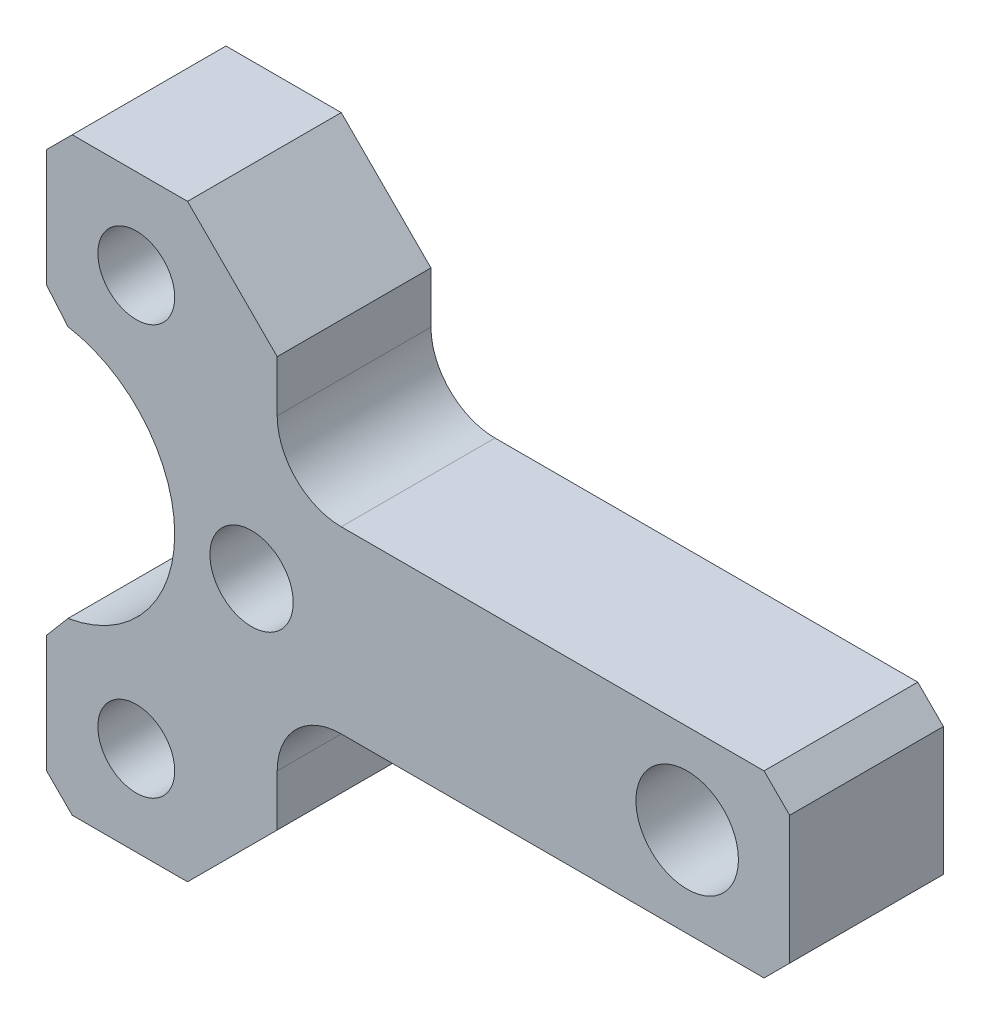
ISO-10303-21;
HEADER;
FILE_DESCRIPTION(('STEP AP214'),'2;1');
FILE_NAME('part.step','',(''),(''),'','','');
FILE_SCHEMA(('AUTOMOTIVE_DESIGN { 1 0 10303 214 1 1 1 1 }'));
ENDSEC;
DATA;
#1=APPLICATION_CONTEXT('core data for automotive mechanical design processes');
#2=APPLICATION_PROTOCOL_DEFINITION('international standard','automotive_design',2000,#1);
#3=PRODUCT_CONTEXT('',#1,'mechanical');
#4=PRODUCT('Part','Part','',(#3));
#5=PRODUCT_RELATED_PRODUCT_CATEGORY('part','',(#4));
#6=PRODUCT_DEFINITION_FORMATION('','',#4);
#7=PRODUCT_DEFINITION_CONTEXT('part definition',#1,'design');
#8=PRODUCT_DEFINITION('design','',#6,#7);
#9=PRODUCT_DEFINITION_SHAPE('','',#8);
#10=(LENGTH_UNIT() NAMED_UNIT(*) SI_UNIT(.MILLI.,.METRE.));
#11=(NAMED_UNIT(*) PLANE_ANGLE_UNIT() SI_UNIT($,.RADIAN.));
#12=(NAMED_UNIT(*) SI_UNIT($,.STERADIAN.) SOLID_ANGLE_UNIT());
#13=UNCERTAINTY_MEASURE_WITH_UNIT(LENGTH_MEASURE(1.E-05),#10,'distance_accuracy_value','');
#14=(GEOMETRIC_REPRESENTATION_CONTEXT(3) GLOBAL_UNCERTAINTY_ASSIGNED_CONTEXT((#13)) GLOBAL_UNIT_ASSIGNED_CONTEXT((#10,
#11,#12)) REPRESENTATION_CONTEXT('',''));
#15=CARTESIAN_POINT('',(0.,0.,0.));
#16=DIRECTION('',(0.,0.,1.));
#17=DIRECTION('',(1.,0.,0.));
#18=AXIS2_PLACEMENT_3D('',#15,#16,#17);
#19=CARTESIAN_POINT('',(23.,-12.,12.));
#20=DIRECTION('',(0.,0.,-1.));
#21=DIRECTION('',(-1.,0.,0.));
#22=AXIS2_PLACEMENT_3D('',#19,#20,#21);
#23=CYLINDRICAL_SURFACE('',#22,5.);
#24=CARTESIAN_POINT('',(23.,-12.,0.));
#25=DIRECTION('',(0.,0.,-1.));
#26=DIRECTION('',(-1.,0.,0.));
#27=AXIS2_PLACEMENT_3D('',#24,#25,#26);
#28=CIRCLE('',#27,5.);
#29=CARTESIAN_POINT('',(18.,-12.,0.));
#30=VERTEX_POINT('',#29);
#31=CARTESIAN_POINT('',(23.,-7.,0.));
#32=VERTEX_POINT('',#31);
#33=EDGE_CURVE('E177',#30,#32,#28,.T.);
#34=ORIENTED_EDGE('',*,*,#33,.T.);
#35=DIRECTION('',(0.,0.,-1.));
#36=VECTOR('',#35,1.);
#37=CARTESIAN_POINT('',(23.,-7.,12.));
#38=LINE('',#37,#36);
#39=CARTESIAN_POINT('',(23.,-7.,12.));
#40=VERTEX_POINT('',#39);
#41=EDGE_CURVE('E185',#40,#32,#38,.T.);
#42=ORIENTED_EDGE('',*,*,#41,.F.);
#43=CARTESIAN_POINT('',(23.,-12.,12.));
#44=DIRECTION('',(0.,0.,-1.));
#45=DIRECTION('',(-1.,0.,0.));
#46=AXIS2_PLACEMENT_3D('',#43,#44,#45);
#47=CIRCLE('',#46,5.);
#48=CARTESIAN_POINT('',(18.,-12.,12.));
#49=VERTEX_POINT('',#48);
#50=EDGE_CURVE('E229',#49,#40,#47,.T.);
#51=ORIENTED_EDGE('',*,*,#50,.F.);
#52=DIRECTION('',(0.,0.,-1.));
#53=VECTOR('',#52,1.);
#54=CARTESIAN_POINT('',(18.,-12.,12.));
#55=LINE('',#54,#53);
#56=EDGE_CURVE('E197',#49,#30,#55,.T.);
#57=ORIENTED_EDGE('',*,*,#56,.T.);
#58=EDGE_LOOP('',(#34,#42,#51,#57));
#59=FACE_BOUND('',#58,.T.);
#60=ADVANCED_FACE('F33',(#59),#23,.F.);
#61=CARTESIAN_POINT('',(23.,-7.,12.));
#62=DIRECTION('',(0.,1.,0.));
#63=DIRECTION('',(0.,0.,1.));
#64=AXIS2_PLACEMENT_3D('',#61,#62,#63);
#65=PLANE('',#64);
#66=DIRECTION('',(1.,0.,0.));
#67=VECTOR('',#66,1.);
#68=CARTESIAN_POINT('',(23.,-7.,0.));
#69=LINE('',#68,#67);
#70=CARTESIAN_POINT('',(56.,-7.,0.));
#71=VERTEX_POINT('',#70);
#72=EDGE_CURVE('E171',#32,#71,#69,.T.);
#73=ORIENTED_EDGE('',*,*,#72,.T.);
#74=DIRECTION('',(0.,0.,1.));
#75=VECTOR('',#74,1.);
#76=CARTESIAN_POINT('',(56.,-7.,12.));
#77=LINE('',#76,#75);
#78=CARTESIAN_POINT('',(56.,-7.,12.));
#79=VERTEX_POINT('',#78);
#80=EDGE_CURVE('E318',#71,#79,#77,.T.);
#81=ORIENTED_EDGE('',*,*,#80,.T.);
#82=DIRECTION('',(1.,0.,0.));
#83=VECTOR('',#82,1.);
#84=CARTESIAN_POINT('',(23.,-7.,12.));
#85=LINE('',#84,#83);
#86=EDGE_CURVE('E188',#40,#79,#85,.T.);
#87=ORIENTED_EDGE('',*,*,#86,.F.);
#88=ORIENTED_EDGE('',*,*,#41,.T.);
#89=EDGE_LOOP('',(#73,#81,#87,#88));
#90=FACE_BOUND('',#89,.T.);
#91=ADVANCED_FACE('F186',(#90),#65,.F.);
#92=CARTESIAN_POINT('',(58.,7.,12.));
#93=DIRECTION('',(-1.,0.,0.));
#94=DIRECTION('',(0.,0.,1.));
#95=AXIS2_PLACEMENT_3D('',#92,#93,#94);
#96=PLANE('',#95);
#97=DIRECTION('',(0.,1.,0.));
#98=VECTOR('',#97,1.);
#99=CARTESIAN_POINT('',(58.,7.,12.));
#100=LINE('',#99,#98);
#101=CARTESIAN_POINT('',(58.,-4.99999999999998,12.));
#102=VERTEX_POINT('',#101);
#103=CARTESIAN_POINT('',(58.,4.99999999999999,12.));
#104=VERTEX_POINT('',#103);
#105=EDGE_CURVE('E232',#102,#104,#100,.T.);
#106=ORIENTED_EDGE('',*,*,#105,.F.);
#107=DIRECTION('',(0.,0.,-1.));
#108=VECTOR('',#107,1.);
#109=CARTESIAN_POINT('',(58.,-4.99999999999999,12.));
#110=LINE('',#109,#108);
#111=CARTESIAN_POINT('',(58.,-4.99999999999999,0.));
#112=VERTEX_POINT('',#111);
#113=EDGE_CURVE('E315',#102,#112,#110,.T.);
#114=ORIENTED_EDGE('',*,*,#113,.T.);
#115=DIRECTION('',(0.,1.,0.));
#116=VECTOR('',#115,1.);
#117=CARTESIAN_POINT('',(58.,7.,0.));
#118=LINE('',#117,#116);
#119=CARTESIAN_POINT('',(58.,4.99999999999999,0.));
#120=VERTEX_POINT('',#119);
#121=EDGE_CURVE('E182',#112,#120,#118,.T.);
#122=ORIENTED_EDGE('',*,*,#121,.T.);
#123=DIRECTION('',(0.,0.,1.));
#124=VECTOR('',#123,1.);
#125=CARTESIAN_POINT('',(58.,4.99999999999999,12.));
#126=LINE('',#125,#124);
#127=EDGE_CURVE('E55',#120,#104,#126,.T.);
#128=ORIENTED_EDGE('',*,*,#127,.T.);
#129=EDGE_LOOP('',(#106,#114,#122,#128));
#130=FACE_BOUND('',#129,.T.);
#131=ADVANCED_FACE('F394',(#130),#96,.F.);
#132=CARTESIAN_POINT('',(23.,7.,12.));
#133=DIRECTION('',(0.,-1.,0.));
#134=DIRECTION('',(0.,0.,-1.));
#135=AXIS2_PLACEMENT_3D('',#132,#133,#134);
#136=PLANE('',#135);
#137=DIRECTION('',(-1.,0.,0.));
#138=VECTOR('',#137,1.);
#139=CARTESIAN_POINT('',(23.,7.,12.));
#140=LINE('',#139,#138);
#141=CARTESIAN_POINT('',(56.,7.,12.));
#142=VERTEX_POINT('',#141);
#143=CARTESIAN_POINT('',(23.,7.,12.));
#144=VERTEX_POINT('',#143);
#145=EDGE_CURVE('E234',#142,#144,#140,.T.);
#146=ORIENTED_EDGE('',*,*,#145,.F.);
#147=DIRECTION('',(0.,0.,-1.));
#148=VECTOR('',#147,1.);
#149=CARTESIAN_POINT('',(56.,7.,12.));
#150=LINE('',#149,#148);
#151=CARTESIAN_POINT('',(56.,7.,0.));
#152=VERTEX_POINT('',#151);
#153=EDGE_CURVE('E11',#142,#152,#150,.T.);
#154=ORIENTED_EDGE('',*,*,#153,.T.);
#155=DIRECTION('',(-1.,0.,0.));
#156=VECTOR('',#155,1.);
#157=CARTESIAN_POINT('',(23.,7.,0.));
#158=LINE('',#157,#156);
#159=CARTESIAN_POINT('',(23.,7.,0.));
#160=VERTEX_POINT('',#159);
#161=EDGE_CURVE('E206',#152,#160,#158,.T.);
#162=ORIENTED_EDGE('',*,*,#161,.T.);
#163=DIRECTION('',(0.,0.,-1.));
#164=VECTOR('',#163,1.);
#165=CARTESIAN_POINT('',(23.,7.,12.));
#166=LINE('',#165,#164);
#167=EDGE_CURVE('E193',#144,#160,#166,.T.);
#168=ORIENTED_EDGE('',*,*,#167,.F.);
#169=EDGE_LOOP('',(#146,#154,#162,#168));
#170=FACE_BOUND('',#169,.T.);
#171=ADVANCED_FACE('F398',(#170),#136,.F.);
#172=CARTESIAN_POINT('',(23.,12.,12.));
#173=DIRECTION('',(0.,0.,-1.));
#174=DIRECTION('',(-1.,0.,0.));
#175=AXIS2_PLACEMENT_3D('',#172,#173,#174);
#176=CYLINDRICAL_SURFACE('',#175,5.);
#177=CARTESIAN_POINT('',(23.,12.,0.));
#178=DIRECTION('',(0.,0.,-1.));
#179=DIRECTION('',(1.,0.,0.));
#180=AXIS2_PLACEMENT_3D('',#177,#178,#179);
#181=CIRCLE('',#180,5.);
#182=CARTESIAN_POINT('',(18.,12.,0.));
#183=VERTEX_POINT('',#182);
#184=EDGE_CURVE('E208',#160,#183,#181,.T.);
#185=ORIENTED_EDGE('',*,*,#184,.T.);
#186=DIRECTION('',(0.,0.,-1.));
#187=VECTOR('',#186,1.);
#188=CARTESIAN_POINT('',(18.,12.,12.));
#189=LINE('',#188,#187);
#190=CARTESIAN_POINT('',(18.,12.,12.));
#191=VERTEX_POINT('',#190);
#192=EDGE_CURVE('E258',#191,#183,#189,.T.);
#193=ORIENTED_EDGE('',*,*,#192,.F.);
#194=CARTESIAN_POINT('',(23.,12.,12.));
#195=DIRECTION('',(0.,0.,-1.));
#196=DIRECTION('',(1.,0.,0.));
#197=AXIS2_PLACEMENT_3D('',#194,#195,#196);
#198=CIRCLE('',#197,5.);
#199=EDGE_CURVE('E236',#144,#191,#198,.T.);
#200=ORIENTED_EDGE('',*,*,#199,.F.);
#201=ORIENTED_EDGE('',*,*,#167,.T.);
#202=EDGE_LOOP('',(#185,#193,#200,#201));
#203=FACE_BOUND('',#202,.T.);
#204=ADVANCED_FACE('F403',(#203),#176,.F.);
#205=CARTESIAN_POINT('',(18.,23.,12.));
#206=DIRECTION('',(-1.,0.,0.));
#207=DIRECTION('',(0.,-1.,0.));
#208=AXIS2_PLACEMENT_3D('',#205,#206,#207);
#209=PLANE('',#208);
#210=DIRECTION('',(0.,1.,0.));
#211=VECTOR('',#210,1.);
#212=CARTESIAN_POINT('',(18.,23.,0.));
#213=LINE('',#212,#211);
#214=CARTESIAN_POINT('',(18.,16.,0.));
#215=VERTEX_POINT('',#214);
#216=EDGE_CURVE('E210',#183,#215,#213,.T.);
#217=ORIENTED_EDGE('',*,*,#216,.T.);
#218=DIRECTION('',(0.,0.,1.));
#219=VECTOR('',#218,1.);
#220=CARTESIAN_POINT('',(18.,16.,12.));
#221=LINE('',#220,#219);
#222=CARTESIAN_POINT('',(18.,16.,12.));
#223=VERTEX_POINT('',#222);
#224=EDGE_CURVE('E270',#215,#223,#221,.T.);
#225=ORIENTED_EDGE('',*,*,#224,.T.);
#226=DIRECTION('',(0.,1.,0.));
#227=VECTOR('',#226,1.);
#228=CARTESIAN_POINT('',(18.,23.,12.));
#229=LINE('',#228,#227);
#230=EDGE_CURVE('E238',#191,#223,#229,.T.);
#231=ORIENTED_EDGE('',*,*,#230,.F.);
#232=ORIENTED_EDGE('',*,*,#192,.T.);
#233=EDGE_LOOP('',(#217,#225,#231,#232));
#234=FACE_BOUND('',#233,.T.);
#235=ADVANCED_FACE('F407',(#234),#209,.F.);
#236=CARTESIAN_POINT('',(0.,23.,12.));
#237=DIRECTION('',(0.,-1.,0.));
#238=DIRECTION('',(0.,0.,-1.));
#239=AXIS2_PLACEMENT_3D('',#236,#237,#238);
#240=PLANE('',#239);
#241=DIRECTION('',(-1.,0.,0.));
#242=VECTOR('',#241,1.);
#243=CARTESIAN_POINT('',(0.,23.,0.));
#244=LINE('',#243,#242);
#245=CARTESIAN_POINT('',(10.9999999999999,23.,0.));
#246=VERTEX_POINT('',#245);
#247=CARTESIAN_POINT('',(2.00000000000001,23.,0.));
#248=VERTEX_POINT('',#247);
#249=EDGE_CURVE('E213',#246,#248,#244,.T.);
#250=ORIENTED_EDGE('',*,*,#249,.T.);
#251=DIRECTION('',(0.,0.,1.));
#252=VECTOR('',#251,1.);
#253=CARTESIAN_POINT('',(2.00000000000001,23.,12.));
#254=LINE('',#253,#252);
#255=CARTESIAN_POINT('',(2.00000000000001,23.,12.));
#256=VERTEX_POINT('',#255);
#257=EDGE_CURVE('E40',#248,#256,#254,.T.);
#258=ORIENTED_EDGE('',*,*,#257,.T.);
#259=DIRECTION('',(-1.,0.,0.));
#260=VECTOR('',#259,1.);
#261=CARTESIAN_POINT('',(0.,23.,12.));
#262=LINE('',#261,#260);
#263=CARTESIAN_POINT('',(10.9999999999999,23.,12.));
#264=VERTEX_POINT('',#263);
#265=EDGE_CURVE('E241',#264,#256,#262,.T.);
#266=ORIENTED_EDGE('',*,*,#265,.F.);
#267=DIRECTION('',(0.,0.,-1.));
#268=VECTOR('',#267,1.);
#269=CARTESIAN_POINT('',(10.9999999999999,23.,12.));
#270=LINE('',#269,#268);
#271=EDGE_CURVE('E192',#264,#246,#270,.T.);
#272=ORIENTED_EDGE('',*,*,#271,.T.);
#273=EDGE_LOOP('',(#250,#258,#266,#272));
#274=FACE_BOUND('',#273,.T.);
#275=ADVANCED_FACE('F330',(#274),#240,.F.);
#276=CARTESIAN_POINT('',(0.,10.,12.));
#277=DIRECTION('',(1.,0.,0.));
#278=DIRECTION('',(0.,0.,-1.));
#279=AXIS2_PLACEMENT_3D('',#276,#277,#278);
#280=PLANE('',#279);
#281=DIRECTION('',(0.,-1.,0.));
#282=VECTOR('',#281,1.);
#283=CARTESIAN_POINT('',(0.,10.,0.));
#284=LINE('',#283,#282);
#285=CARTESIAN_POINT('',(0.,21.,0.));
#286=VERTEX_POINT('',#285);
#287=CARTESIAN_POINT('',(0.,11.8321595661992,0.));
#288=VERTEX_POINT('',#287);
#289=EDGE_CURVE('E216',#286,#288,#284,.T.);
#290=ORIENTED_EDGE('',*,*,#289,.T.);
#291=DIRECTION('',(0.,0.,1.));
#292=VECTOR('',#291,1.);
#293=CARTESIAN_POINT('',(0.,11.8321595661992,12.));
#294=LINE('',#293,#292);
#295=CARTESIAN_POINT('',(0.,11.8321595661992,12.));
#296=VERTEX_POINT('',#295);
#297=EDGE_CURVE('E301',#288,#296,#294,.T.);
#298=ORIENTED_EDGE('',*,*,#297,.T.);
#299=DIRECTION('',(0.,-1.,0.));
#300=VECTOR('',#299,1.);
#301=CARTESIAN_POINT('',(0.,10.,12.));
#302=LINE('',#301,#300);
#303=CARTESIAN_POINT('',(0.,21.,12.));
#304=VERTEX_POINT('',#303);
#305=EDGE_CURVE('E244',#304,#296,#302,.T.);
#306=ORIENTED_EDGE('',*,*,#305,.F.);
#307=DIRECTION('',(0.,0.,-1.));
#308=VECTOR('',#307,1.);
#309=CARTESIAN_POINT('',(0.,21.,12.));
#310=LINE('',#309,#308);
#311=EDGE_CURVE('E298',#304,#286,#310,.T.);
#312=ORIENTED_EDGE('',*,*,#311,.T.);
#313=EDGE_LOOP('',(#290,#298,#306,#312));
#314=FACE_BOUND('',#313,.T.);
#315=ADVANCED_FACE('F342',(#314),#280,.F.);
#316=CARTESIAN_POINT('',(0.,0.,12.));
#317=DIRECTION('',(0.,0.,-1.));
#318=DIRECTION('',(-1.,0.,0.));
#319=AXIS2_PLACEMENT_3D('',#316,#317,#318);
#320=CYLINDRICAL_SURFACE('',#319,10.);
#321=CARTESIAN_POINT('',(0.,0.,12.));
#322=DIRECTION('',(0.,0.,-1.));
#323=DIRECTION('',(1.,0.,0.));
#324=AXIS2_PLACEMENT_3D('',#321,#322,#323);
#325=CIRCLE('',#324,10.);
#326=CARTESIAN_POINT('',(1.66666666666669,9.86013297183269,12.));
#327=VERTEX_POINT('',#326);
#328=CARTESIAN_POINT('',(1.66666666666668,-9.86013297183269,12.));
#329=VERTEX_POINT('',#328);
#330=EDGE_CURVE('E247',#327,#329,#325,.T.);
#331=ORIENTED_EDGE('',*,*,#330,.F.);
#332=DIRECTION('',(0.,0.,-1.));
#333=VECTOR('',#332,1.);
#334=CARTESIAN_POINT('',(1.66666666666669,9.86013297183269,12.));
#335=LINE('',#334,#333);
#336=CARTESIAN_POINT('',(1.66666666666669,9.86013297183269,0.));
#337=VERTEX_POINT('',#336);
#338=EDGE_CURVE('E284',#327,#337,#335,.T.);
#339=ORIENTED_EDGE('',*,*,#338,.T.);
#340=CARTESIAN_POINT('',(0.,0.,0.));
#341=DIRECTION('',(0.,0.,-1.));
#342=DIRECTION('',(1.,0.,0.));
#343=AXIS2_PLACEMENT_3D('',#340,#341,#342);
#344=CIRCLE('',#343,10.);
#345=CARTESIAN_POINT('',(1.66666666666667,-9.86013297183269,0.));
#346=VERTEX_POINT('',#345);
#347=EDGE_CURVE('E219',#337,#346,#344,.T.);
#348=ORIENTED_EDGE('',*,*,#347,.T.);
#349=DIRECTION('',(0.,0.,-1.));
#350=VECTOR('',#349,1.);
#351=CARTESIAN_POINT('',(1.66666666666667,-9.86013297183269,12.));
#352=LINE('',#351,#350);
#353=EDGE_CURVE('E282',#346,#329,#352,.F.);
#354=ORIENTED_EDGE('',*,*,#353,.T.);
#355=EDGE_LOOP('',(#331,#339,#348,#354));
#356=FACE_BOUND('',#355,.T.);
#357=ADVANCED_FACE('F350',(#356),#320,.F.);
#358=CARTESIAN_POINT('',(0.,-23.,12.));
#359=DIRECTION('',(1.,0.,0.));
#360=DIRECTION('',(0.,0.,-1.));
#361=AXIS2_PLACEMENT_3D('',#358,#359,#360);
#362=PLANE('',#361);
#363=DIRECTION('',(0.,-1.,0.));
#364=VECTOR('',#363,1.);
#365=CARTESIAN_POINT('',(0.,-23.,12.));
#366=LINE('',#365,#364);
#367=CARTESIAN_POINT('',(0.,-11.8321595661993,12.));
#368=VERTEX_POINT('',#367);
#369=CARTESIAN_POINT('',(0.,-21.,12.));
#370=VERTEX_POINT('',#369);
#371=EDGE_CURVE('E250',#368,#370,#366,.T.);
#372=ORIENTED_EDGE('',*,*,#371,.F.);
#373=DIRECTION('',(0.,0.,-1.));
#374=VECTOR('',#373,1.);
#375=CARTESIAN_POINT('',(0.,-11.8321595661993,12.));
#376=LINE('',#375,#374);
#377=CARTESIAN_POINT('',(0.,-11.8321595661993,0.));
#378=VERTEX_POINT('',#377);
#379=EDGE_CURVE('E322',#368,#378,#376,.T.);
#380=ORIENTED_EDGE('',*,*,#379,.T.);
#381=DIRECTION('',(0.,-1.,0.));
#382=VECTOR('',#381,1.);
#383=CARTESIAN_POINT('',(0.,-23.,0.));
#384=LINE('',#383,#382);
#385=CARTESIAN_POINT('',(0.,-21.,0.));
#386=VERTEX_POINT('',#385);
#387=EDGE_CURVE('E222',#378,#386,#384,.T.);
#388=ORIENTED_EDGE('',*,*,#387,.T.);
#389=DIRECTION('',(0.,0.,1.));
#390=VECTOR('',#389,1.);
#391=CARTESIAN_POINT('',(0.,-21.,12.));
#392=LINE('',#391,#390);
#393=EDGE_CURVE('E320',#386,#370,#392,.T.);
#394=ORIENTED_EDGE('',*,*,#393,.T.);
#395=EDGE_LOOP('',(#372,#380,#388,#394));
#396=FACE_BOUND('',#395,.T.);
#397=ADVANCED_FACE('F359',(#396),#362,.F.);
#398=CARTESIAN_POINT('',(0.,-23.,12.));
#399=DIRECTION('',(0.,1.,0.));
#400=DIRECTION('',(0.,0.,1.));
#401=AXIS2_PLACEMENT_3D('',#398,#399,#400);
#402=PLANE('',#401);
#403=DIRECTION('',(1.,0.,0.));
#404=VECTOR('',#403,1.);
#405=CARTESIAN_POINT('',(0.,-23.,12.));
#406=LINE('',#405,#404);
#407=CARTESIAN_POINT('',(2.00000000000003,-23.,12.));
#408=VERTEX_POINT('',#407);
#409=CARTESIAN_POINT('',(10.9999999999999,-23.,12.));
#410=VERTEX_POINT('',#409);
#411=EDGE_CURVE('E253',#408,#410,#406,.T.);
#412=ORIENTED_EDGE('',*,*,#411,.F.);
#413=DIRECTION('',(0.,0.,-1.));
#414=VECTOR('',#413,1.);
#415=CARTESIAN_POINT('',(2.00000000000004,-23.,12.));
#416=LINE('',#415,#414);
#417=CARTESIAN_POINT('',(2.00000000000003,-23.,0.));
#418=VERTEX_POINT('',#417);
#419=EDGE_CURVE('E325',#408,#418,#416,.T.);
#420=ORIENTED_EDGE('',*,*,#419,.T.);
#421=DIRECTION('',(1.,0.,0.));
#422=VECTOR('',#421,1.);
#423=CARTESIAN_POINT('',(0.,-23.,0.));
#424=LINE('',#423,#422);
#425=CARTESIAN_POINT('',(10.9999999999999,-23.,0.));
#426=VERTEX_POINT('',#425);
#427=EDGE_CURVE('E225',#418,#426,#424,.T.);
#428=ORIENTED_EDGE('',*,*,#427,.T.);
#429=DIRECTION('',(0.,0.,1.));
#430=VECTOR('',#429,1.);
#431=CARTESIAN_POINT('',(10.9999999999999,-23.,12.));
#432=LINE('',#431,#430);
#433=EDGE_CURVE('E279',#426,#410,#432,.T.);
#434=ORIENTED_EDGE('',*,*,#433,.T.);
#435=EDGE_LOOP('',(#412,#420,#428,#434));
#436=FACE_BOUND('',#435,.T.);
#437=ADVANCED_FACE('F368',(#436),#402,.F.);
#438=CARTESIAN_POINT('',(18.,-23.,12.));
#439=DIRECTION('',(-1.,0.,0.));
#440=DIRECTION('',(0.,-1.,0.));
#441=AXIS2_PLACEMENT_3D('',#438,#439,#440);
#442=PLANE('',#441);
#443=DIRECTION('',(0.,1.,0.));
#444=VECTOR('',#443,1.);
#445=CARTESIAN_POINT('',(18.,-23.,12.));
#446=LINE('',#445,#444);
#447=CARTESIAN_POINT('',(18.,-15.9999999999999,12.));
#448=VERTEX_POINT('',#447);
#449=EDGE_CURVE('E255',#448,#49,#446,.T.);
#450=ORIENTED_EDGE('',*,*,#449,.F.);
#451=DIRECTION('',(0.,0.,-1.));
#452=VECTOR('',#451,1.);
#453=CARTESIAN_POINT('',(18.,-15.9999999999999,12.));
#454=LINE('',#453,#452);
#455=CARTESIAN_POINT('',(18.,-15.9999999999999,0.));
#456=VERTEX_POINT('',#455);
#457=EDGE_CURVE('E276',#448,#456,#454,.T.);
#458=ORIENTED_EDGE('',*,*,#457,.T.);
#459=DIRECTION('',(0.,1.,0.));
#460=VECTOR('',#459,1.);
#461=CARTESIAN_POINT('',(18.,-23.,0.));
#462=LINE('',#461,#460);
#463=EDGE_CURVE('E227',#456,#30,#462,.T.);
#464=ORIENTED_EDGE('',*,*,#463,.T.);
#465=ORIENTED_EDGE('',*,*,#56,.F.);
#466=EDGE_LOOP('',(#450,#458,#464,#465));
#467=FACE_BOUND('',#466,.T.);
#468=ADVANCED_FACE('F375',(#467),#442,.F.);
#469=CARTESIAN_POINT('',(23.,-12.,12.));
#470=DIRECTION('',(0.,0.,-1.));
#471=DIRECTION('',(-1.,0.,0.));
#472=AXIS2_PLACEMENT_3D('',#469,#470,#471);
#473=PLANE('',#472);
#474=CARTESIAN_POINT('',(16.,0.,12.));
#475=DIRECTION('',(0.,0.,1.));
#476=DIRECTION('',(1.,0.,0.));
#477=AXIS2_PLACEMENT_3D('',#474,#475,#476);
#478=CIRCLE('',#477,3.25);
#479=CARTESIAN_POINT('',(19.25,0.,12.));
#480=VERTEX_POINT('',#479);
#481=EDGE_CURVE('E458',#480,#480,#478,.T.);
#482=ORIENTED_EDGE('',*,*,#481,.F.);
#483=EDGE_LOOP('',(#482));
#484=FACE_BOUND('',#483,.T.);
#485=CARTESIAN_POINT('',(50.,0.,12.));
#486=DIRECTION('',(0.,0.,1.));
#487=DIRECTION('',(1.,0.,0.));
#488=AXIS2_PLACEMENT_3D('',#485,#486,#487);
#489=CIRCLE('',#488,4.00000000000001);
#490=CARTESIAN_POINT('',(54.,0.,12.));
#491=VERTEX_POINT('',#490);
#492=EDGE_CURVE('E454',#491,#491,#489,.T.);
#493=ORIENTED_EDGE('',*,*,#492,.F.);
#494=EDGE_LOOP('',(#493));
#495=FACE_BOUND('',#494,.T.);
#496=CARTESIAN_POINT('',(7.,-16.,12.));
#497=DIRECTION('',(0.,0.,1.));
#498=DIRECTION('',(1.,0.,0.));
#499=AXIS2_PLACEMENT_3D('',#496,#497,#498);
#500=CIRCLE('',#499,3.);
#501=CARTESIAN_POINT('',(10.,-16.,12.));
#502=VERTEX_POINT('',#501);
#503=EDGE_CURVE('E448',#502,#502,#500,.T.);
#504=ORIENTED_EDGE('',*,*,#503,.F.);
#505=EDGE_LOOP('',(#504));
#506=FACE_BOUND('',#505,.T.);
#507=CARTESIAN_POINT('',(7.,16.,12.));
#508=DIRECTION('',(0.,0.,1.));
#509=DIRECTION('',(1.,0.,0.));
#510=AXIS2_PLACEMENT_3D('',#507,#508,#509);
#511=CIRCLE('',#510,3.);
#512=CARTESIAN_POINT('',(10.,16.,12.));
#513=VERTEX_POINT('',#512);
#514=EDGE_CURVE('E201',#513,#513,#511,.T.);
#515=ORIENTED_EDGE('',*,*,#514,.F.);
#516=EDGE_LOOP('',(#515));
#517=FACE_BOUND('',#516,.T.);
#518=ORIENTED_EDGE('',*,*,#305,.T.);
#519=DIRECTION('',(-0.645497224367907,0.76376261582597,0.));
#520=VECTOR('',#519,1.);
#521=CARTESIAN_POINT('',(1.66666666666669,9.86013297183269,12.));
#522=LINE('',#521,#520);
#523=EDGE_CURVE('E312',#296,#327,#522,.F.);
#524=ORIENTED_EDGE('',*,*,#523,.T.);
#525=ORIENTED_EDGE('',*,*,#330,.T.);
#526=DIRECTION('',(0.645497224367898,0.763762615825977,0.));
#527=VECTOR('',#526,1.);
#528=CARTESIAN_POINT('',(0.,-11.8321595661993,12.));
#529=LINE('',#528,#527);
#530=EDGE_CURVE('E308',#329,#368,#529,.F.);
#531=ORIENTED_EDGE('',*,*,#530,.T.);
#532=ORIENTED_EDGE('',*,*,#371,.T.);
#533=DIRECTION('',(-0.707106781186551,0.707106781186544,0.));
#534=VECTOR('',#533,1.);
#535=CARTESIAN_POINT('',(2.00000000000004,-23.,12.));
#536=LINE('',#535,#534);
#537=EDGE_CURVE('E306',#370,#408,#536,.F.);
#538=ORIENTED_EDGE('',*,*,#537,.T.);
#539=ORIENTED_EDGE('',*,*,#411,.T.);
#540=DIRECTION('',(-0.707106781186544,-0.707106781186551,0.));
#541=VECTOR('',#540,1.);
#542=CARTESIAN_POINT('',(18.,-15.9999999999999,12.));
#543=LINE('',#542,#541);
#544=EDGE_CURVE('E272',#410,#448,#543,.F.);
#545=ORIENTED_EDGE('',*,*,#544,.T.);
#546=ORIENTED_EDGE('',*,*,#449,.T.);
#547=ORIENTED_EDGE('',*,*,#50,.T.);
#548=ORIENTED_EDGE('',*,*,#86,.T.);
#549=DIRECTION('',(-0.707106781186552,-0.707106781186544,0.));
#550=VECTOR('',#549,1.);
#551=CARTESIAN_POINT('',(58.,-4.99999999999999,12.));
#552=LINE('',#551,#550);
#553=EDGE_CURVE('E310',#79,#102,#552,.F.);
#554=ORIENTED_EDGE('',*,*,#553,.T.);
#555=ORIENTED_EDGE('',*,*,#105,.T.);
#556=DIRECTION('',(0.707106781186553,-0.707106781186542,0.));
#557=VECTOR('',#556,1.);
#558=CARTESIAN_POINT('',(56.,7.,12.));
#559=LINE('',#558,#557);
#560=EDGE_CURVE('E47',#104,#142,#559,.F.);
#561=ORIENTED_EDGE('',*,*,#560,.T.);
#562=ORIENTED_EDGE('',*,*,#145,.T.);
#563=ORIENTED_EDGE('',*,*,#199,.T.);
#564=ORIENTED_EDGE('',*,*,#230,.T.);
#565=DIRECTION('',(0.707106781186551,-0.707106781186544,0.));
#566=VECTOR('',#565,1.);
#567=CARTESIAN_POINT('',(10.9999999999999,23.,12.));
#568=LINE('',#567,#566);
#569=EDGE_CURVE('E274',#223,#264,#568,.F.);
#570=ORIENTED_EDGE('',*,*,#569,.T.);
#571=ORIENTED_EDGE('',*,*,#265,.T.);
#572=DIRECTION('',(0.707106781186544,0.707106781186551,0.));
#573=VECTOR('',#572,1.);
#574=CARTESIAN_POINT('',(0.,21.,12.));
#575=LINE('',#574,#573);
#576=EDGE_CURVE('E304',#256,#304,#575,.F.);
#577=ORIENTED_EDGE('',*,*,#576,.T.);
#578=EDGE_LOOP('',(#518,#524,#525,#531,#532,#538,#539,#545,#546,#547,#548,#554,#555,#561,#562,
#563,#564,#570,#571,#577));
#579=FACE_BOUND('',#578,.T.);
#580=ADVANCED_FACE('F335',(#484,#495,#506,#517,#579),#473,.F.);
#581=CARTESIAN_POINT('',(23.,-12.,0.));
#582=DIRECTION('',(0.,0.,-1.));
#583=DIRECTION('',(-1.,0.,0.));
#584=AXIS2_PLACEMENT_3D('',#581,#582,#583);
#585=PLANE('',#584);
#586=CARTESIAN_POINT('',(16.,0.,0.));
#587=DIRECTION('',(0.,0.,1.));
#588=DIRECTION('',(1.,0.,0.));
#589=AXIS2_PLACEMENT_3D('',#586,#587,#588);
#590=CIRCLE('',#589,3.25);
#591=CARTESIAN_POINT('',(19.25,0.,0.));
#592=VERTEX_POINT('',#591);
#593=EDGE_CURVE('E434',#592,#592,#590,.T.);
#594=ORIENTED_EDGE('',*,*,#593,.T.);
#595=EDGE_LOOP('',(#594));
#596=FACE_BOUND('',#595,.T.);
#597=CARTESIAN_POINT('',(50.,0.,0.));
#598=DIRECTION('',(0.,0.,1.));
#599=DIRECTION('',(1.,0.,0.));
#600=AXIS2_PLACEMENT_3D('',#597,#598,#599);
#601=CIRCLE('',#600,4.00000000000001);
#602=CARTESIAN_POINT('',(54.,0.,0.));
#603=VERTEX_POINT('',#602);
#604=EDGE_CURVE('E438',#603,#603,#601,.T.);
#605=ORIENTED_EDGE('',*,*,#604,.T.);
#606=EDGE_LOOP('',(#605));
#607=FACE_BOUND('',#606,.T.);
#608=CARTESIAN_POINT('',(7.,-16.,0.));
#609=DIRECTION('',(0.,0.,1.));
#610=DIRECTION('',(1.,0.,0.));
#611=AXIS2_PLACEMENT_3D('',#608,#609,#610);
#612=CIRCLE('',#611,3.);
#613=CARTESIAN_POINT('',(10.,-16.,0.));
#614=VERTEX_POINT('',#613);
#615=EDGE_CURVE('E442',#614,#614,#612,.T.);
#616=ORIENTED_EDGE('',*,*,#615,.T.);
#617=EDGE_LOOP('',(#616));
#618=FACE_BOUND('',#617,.T.);
#619=CARTESIAN_POINT('',(7.,16.,0.));
#620=DIRECTION('',(0.,0.,1.));
#621=DIRECTION('',(1.,0.,0.));
#622=AXIS2_PLACEMENT_3D('',#619,#620,#621);
#623=CIRCLE('',#622,3.);
#624=CARTESIAN_POINT('',(10.,16.,0.));
#625=VERTEX_POINT('',#624);
#626=EDGE_CURVE('E198',#625,#625,#623,.T.);
#627=ORIENTED_EDGE('',*,*,#626,.T.);
#628=EDGE_LOOP('',(#627));
#629=FACE_BOUND('',#628,.T.);
#630=ORIENTED_EDGE('',*,*,#347,.F.);
#631=DIRECTION('',(0.645497224367907,-0.76376261582597,0.));
#632=VECTOR('',#631,1.);
#633=CARTESIAN_POINT('',(21.3327464497664,-13.4090864316911,0.));
#634=LINE('',#633,#632);
#635=EDGE_CURVE('E296',#337,#288,#634,.F.);
#636=ORIENTED_EDGE('',*,*,#635,.T.);
#637=ORIENTED_EDGE('',*,*,#289,.F.);
#638=DIRECTION('',(-0.707106781186544,-0.707106781186551,0.));
#639=VECTOR('',#638,1.);
#640=CARTESIAN_POINT('',(-5.00000000000011,15.9999999999998,0.));
#641=LINE('',#640,#639);
#642=EDGE_CURVE('E289',#286,#248,#641,.F.);
#643=ORIENTED_EDGE('',*,*,#642,.T.);
#644=ORIENTED_EDGE('',*,*,#249,.F.);
#645=DIRECTION('',(-0.707106781186551,0.707106781186544,0.));
#646=VECTOR('',#645,1.);
#647=CARTESIAN_POINT('',(34.5,-0.499999999999863,0.));
#648=LINE('',#647,#646);
#649=EDGE_CURVE('E268',#246,#215,#648,.F.);
#650=ORIENTED_EDGE('',*,*,#649,.T.);
#651=ORIENTED_EDGE('',*,*,#216,.F.);
#652=ORIENTED_EDGE('',*,*,#184,.F.);
#653=ORIENTED_EDGE('',*,*,#161,.F.);
#654=DIRECTION('',(-0.707106781186553,0.707106781186542,0.));
#655=VECTOR('',#654,1.);
#656=CARTESIAN_POINT('',(48.9999999999997,14.0000000000001,0.));
#657=LINE('',#656,#655);
#658=EDGE_CURVE('E287',#152,#120,#657,.F.);
#659=ORIENTED_EDGE('',*,*,#658,.T.);
#660=ORIENTED_EDGE('',*,*,#121,.F.);
#661=DIRECTION('',(0.707106781186552,0.707106781186544,0.));
#662=VECTOR('',#661,1.);
#663=CARTESIAN_POINT('',(36.9999999999998,-26.,0.));
#664=LINE('',#663,#662);
#665=EDGE_CURVE('E179',#112,#71,#664,.F.);
#666=ORIENTED_EDGE('',*,*,#665,.T.);
#667=ORIENTED_EDGE('',*,*,#72,.F.);
#668=ORIENTED_EDGE('',*,*,#33,.F.);
#669=ORIENTED_EDGE('',*,*,#463,.F.);
#670=DIRECTION('',(0.707106781186544,0.707106781186551,0.));
#671=VECTOR('',#670,1.);
#672=CARTESIAN_POINT('',(22.4999999999999,-11.4999999999999,0.));
#673=LINE('',#672,#671);
#674=EDGE_CURVE('E265',#456,#426,#673,.F.);
#675=ORIENTED_EDGE('',*,*,#674,.T.);
#676=ORIENTED_EDGE('',*,*,#427,.F.);
#677=DIRECTION('',(0.707106781186551,-0.707106781186544,0.));
#678=VECTOR('',#677,1.);
#679=CARTESIAN_POINT('',(7.00000000000012,-28.,0.));
#680=LINE('',#679,#678);
#681=EDGE_CURVE('E291',#418,#386,#680,.F.);
#682=ORIENTED_EDGE('',*,*,#681,.T.);
#683=ORIENTED_EDGE('',*,*,#387,.F.);
#684=DIRECTION('',(-0.645497224367898,-0.763762615825977,0.));
#685=VECTOR('',#684,1.);
#686=CARTESIAN_POINT('',(9.50058688356692,-0.590913568308786,0.));
#687=LINE('',#686,#685);
#688=EDGE_CURVE('E293',#378,#346,#687,.F.);
#689=ORIENTED_EDGE('',*,*,#688,.T.);
#690=EDGE_LOOP('',(#630,#636,#637,#643,#644,#650,#651,#652,#653,#659,#660,#666,#667,#668,#669,
#675,#676,#682,#683,#689));
#691=FACE_BOUND('',#690,.T.);
#692=ADVANCED_FACE('F174',(#596,#607,#618,#629,#691),#585,.T.);
#693=CARTESIAN_POINT('',(10.9999999999999,23.,12.));
#694=DIRECTION('',(-0.707106781186544,-0.707106781186551,0.));
#695=DIRECTION('',(0.707106781186551,-0.707106781186544,0.));
#696=AXIS2_PLACEMENT_3D('',#693,#694,#695);
#697=PLANE('',#696);
#698=ORIENTED_EDGE('',*,*,#569,.F.);
#699=ORIENTED_EDGE('',*,*,#224,.F.);
#700=ORIENTED_EDGE('',*,*,#649,.F.);
#701=ORIENTED_EDGE('',*,*,#271,.F.);
#702=EDGE_LOOP('',(#698,#699,#700,#701));
#703=FACE_BOUND('',#702,.T.);
#704=ADVANCED_FACE('F379',(#703),#697,.F.);
#705=CARTESIAN_POINT('',(18.,-15.9999999999999,12.));
#706=DIRECTION('',(-0.707106781186551,0.707106781186544,0.));
#707=DIRECTION('',(-0.707106781186544,-0.707106781186551,0.));
#708=AXIS2_PLACEMENT_3D('',#705,#706,#707);
#709=PLANE('',#708);
#710=ORIENTED_EDGE('',*,*,#544,.F.);
#711=ORIENTED_EDGE('',*,*,#433,.F.);
#712=ORIENTED_EDGE('',*,*,#674,.F.);
#713=ORIENTED_EDGE('',*,*,#457,.F.);
#714=EDGE_LOOP('',(#710,#711,#712,#713));
#715=FACE_BOUND('',#714,.T.);
#716=ADVANCED_FACE('F376',(#715),#709,.F.);
#717=CARTESIAN_POINT('',(7.,16.,0.));
#718=DIRECTION('',(0.,0.,1.));
#719=DIRECTION('',(1.,0.,0.));
#720=AXIS2_PLACEMENT_3D('',#717,#718,#719);
#721=CYLINDRICAL_SURFACE('',#720,3.);
#722=ORIENTED_EDGE('',*,*,#626,.F.);
#723=EDGE_LOOP('',(#722));
#724=FACE_BOUND('',#723,.T.);
#725=ORIENTED_EDGE('',*,*,#514,.T.);
#726=EDGE_LOOP('',(#725));
#727=FACE_BOUND('',#726,.T.);
#728=ADVANCED_FACE('F378',(#724,#727),#721,.F.);
#729=CARTESIAN_POINT('',(7.,-16.,0.));
#730=DIRECTION('',(0.,0.,1.));
#731=DIRECTION('',(1.,0.,0.));
#732=AXIS2_PLACEMENT_3D('',#729,#730,#731);
#733=CYLINDRICAL_SURFACE('',#732,3.);
#734=ORIENTED_EDGE('',*,*,#615,.F.);
#735=EDGE_LOOP('',(#734));
#736=FACE_BOUND('',#735,.T.);
#737=ORIENTED_EDGE('',*,*,#503,.T.);
#738=EDGE_LOOP('',(#737));
#739=FACE_BOUND('',#738,.T.);
#740=ADVANCED_FACE('F385',(#736,#739),#733,.F.);
#741=CARTESIAN_POINT('',(50.,0.,0.));
#742=DIRECTION('',(0.,0.,1.));
#743=DIRECTION('',(1.,0.,0.));
#744=AXIS2_PLACEMENT_3D('',#741,#742,#743);
#745=CYLINDRICAL_SURFACE('',#744,4.00000000000001);
#746=ORIENTED_EDGE('',*,*,#604,.F.);
#747=EDGE_LOOP('',(#746));
#748=FACE_BOUND('',#747,.T.);
#749=ORIENTED_EDGE('',*,*,#492,.T.);
#750=EDGE_LOOP('',(#749));
#751=FACE_BOUND('',#750,.T.);
#752=ADVANCED_FACE('F469',(#748,#751),#745,.F.);
#753=CARTESIAN_POINT('',(16.,0.,0.));
#754=DIRECTION('',(0.,0.,1.));
#755=DIRECTION('',(1.,0.,0.));
#756=AXIS2_PLACEMENT_3D('',#753,#754,#755);
#757=CYLINDRICAL_SURFACE('',#756,3.25);
#758=ORIENTED_EDGE('',*,*,#593,.F.);
#759=EDGE_LOOP('',(#758));
#760=FACE_BOUND('',#759,.T.);
#761=ORIENTED_EDGE('',*,*,#481,.T.);
#762=EDGE_LOOP('',(#761));
#763=FACE_BOUND('',#762,.T.);
#764=ADVANCED_FACE('F462',(#760,#763),#757,.F.);
#765=CARTESIAN_POINT('',(1.66666666666669,9.86013297183269,12.));
#766=DIRECTION('',(0.76376261582597,0.645497224367907,0.));
#767=DIRECTION('',(-0.645497224367907,0.76376261582597,0.));
#768=AXIS2_PLACEMENT_3D('',#765,#766,#767);
#769=PLANE('',#768);
#770=ORIENTED_EDGE('',*,*,#523,.F.);
#771=ORIENTED_EDGE('',*,*,#297,.F.);
#772=ORIENTED_EDGE('',*,*,#635,.F.);
#773=ORIENTED_EDGE('',*,*,#338,.F.);
#774=EDGE_LOOP('',(#770,#771,#772,#773));
#775=FACE_BOUND('',#774,.T.);
#776=ADVANCED_FACE('F347',(#775),#769,.F.);
#777=CARTESIAN_POINT('',(58.,-4.99999999999999,12.));
#778=DIRECTION('',(-0.707106781186544,0.707106781186552,0.));
#779=DIRECTION('',(-0.707106781186552,-0.707106781186544,0.));
#780=AXIS2_PLACEMENT_3D('',#777,#778,#779);
#781=PLANE('',#780);
#782=ORIENTED_EDGE('',*,*,#553,.F.);
#783=ORIENTED_EDGE('',*,*,#80,.F.);
#784=ORIENTED_EDGE('',*,*,#665,.F.);
#785=ORIENTED_EDGE('',*,*,#113,.F.);
#786=EDGE_LOOP('',(#782,#783,#784,#785));
#787=FACE_BOUND('',#786,.T.);
#788=ADVANCED_FACE('F483',(#787),#781,.F.);
#789=CARTESIAN_POINT('',(0.,-11.8321595661993,12.));
#790=DIRECTION('',(0.763762615825977,-0.645497224367898,0.));
#791=DIRECTION('',(0.645497224367898,0.763762615825977,0.));
#792=AXIS2_PLACEMENT_3D('',#789,#790,#791);
#793=PLANE('',#792);
#794=ORIENTED_EDGE('',*,*,#530,.F.);
#795=ORIENTED_EDGE('',*,*,#353,.F.);
#796=ORIENTED_EDGE('',*,*,#688,.F.);
#797=ORIENTED_EDGE('',*,*,#379,.F.);
#798=EDGE_LOOP('',(#794,#795,#796,#797));
#799=FACE_BOUND('',#798,.T.);
#800=ADVANCED_FACE('F356',(#799),#793,.F.);
#801=CARTESIAN_POINT('',(2.00000000000004,-23.,12.));
#802=DIRECTION('',(0.707106781186544,0.707106781186551,0.));
#803=DIRECTION('',(-0.707106781186551,0.707106781186544,0.));
#804=AXIS2_PLACEMENT_3D('',#801,#802,#803);
#805=PLANE('',#804);
#806=ORIENTED_EDGE('',*,*,#537,.F.);
#807=ORIENTED_EDGE('',*,*,#393,.F.);
#808=ORIENTED_EDGE('',*,*,#681,.F.);
#809=ORIENTED_EDGE('',*,*,#419,.F.);
#810=EDGE_LOOP('',(#806,#807,#808,#809));
#811=FACE_BOUND('',#810,.T.);
#812=ADVANCED_FACE('F365',(#811),#805,.F.);
#813=CARTESIAN_POINT('',(0.,21.,12.));
#814=DIRECTION('',(0.707106781186551,-0.707106781186544,0.));
#815=DIRECTION('',(0.707106781186544,0.707106781186551,0.));
#816=AXIS2_PLACEMENT_3D('',#813,#814,#815);
#817=PLANE('',#816);
#818=ORIENTED_EDGE('',*,*,#576,.F.);
#819=ORIENTED_EDGE('',*,*,#257,.F.);
#820=ORIENTED_EDGE('',*,*,#642,.F.);
#821=ORIENTED_EDGE('',*,*,#311,.F.);
#822=EDGE_LOOP('',(#818,#819,#820,#821));
#823=FACE_BOUND('',#822,.T.);
#824=ADVANCED_FACE('F339',(#823),#817,.F.);
#825=CARTESIAN_POINT('',(56.,7.,12.));
#826=DIRECTION('',(-0.707106781186542,-0.707106781186553,0.));
#827=DIRECTION('',(0.707106781186553,-0.707106781186542,0.));
#828=AXIS2_PLACEMENT_3D('',#825,#826,#827);
#829=PLANE('',#828);
#830=ORIENTED_EDGE('',*,*,#560,.F.);
#831=ORIENTED_EDGE('',*,*,#127,.F.);
#832=ORIENTED_EDGE('',*,*,#658,.F.);
#833=ORIENTED_EDGE('',*,*,#153,.F.);
#834=EDGE_LOOP('',(#830,#831,#832,#833));
#835=FACE_BOUND('',#834,.T.);
#836=ADVANCED_FACE('F493',(#835),#829,.F.);
#837=CLOSED_SHELL('',(#60,#91,#131,#171,#204,#235,#275,#315,#357,#397,#437,#468,#580,#692,#704,
#716,#728,#740,#752,#764,#776,#788,#800,#812,#824,#836));
#838=MANIFOLD_SOLID_BREP('B2',#837);
#839=ADVANCED_BREP_SHAPE_REPRESENTATION('',(#18,#838),#14);
#840=SHAPE_DEFINITION_REPRESENTATION(#9,#839);
ENDSEC;
END-ISO-10303-21;
